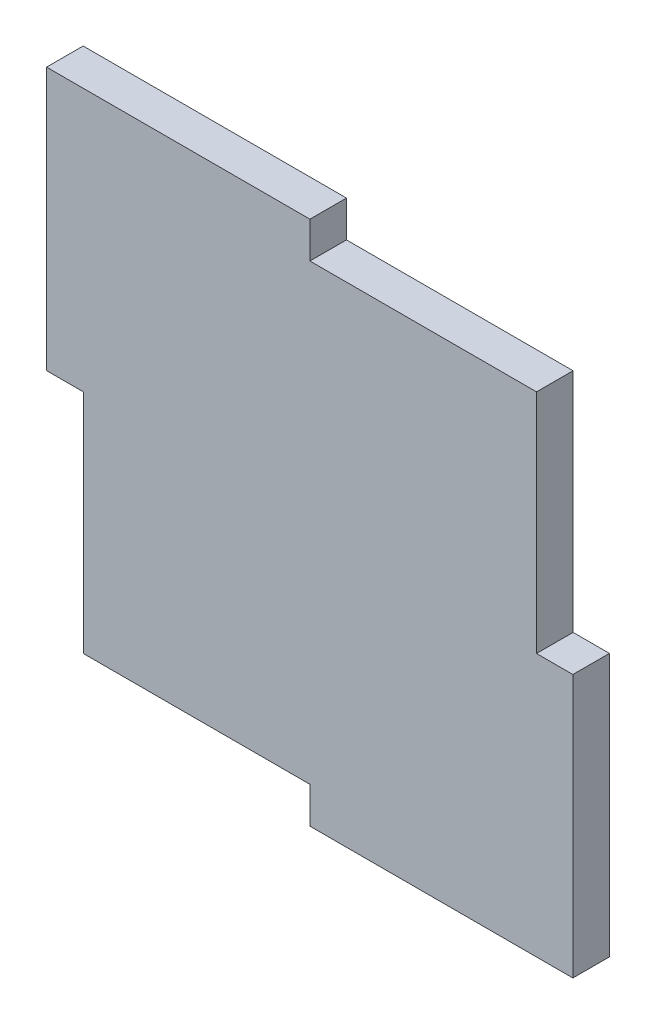
ISO-10303-21;
HEADER;
FILE_DESCRIPTION(('STEP AP214'),'2;1');
FILE_NAME('part.step','',(''),(''),'','','');
FILE_SCHEMA(('AUTOMOTIVE_DESIGN { 1 0 10303 214 1 1 1 1 }'));
ENDSEC;
DATA;
#1=APPLICATION_CONTEXT('core data for automotive mechanical design processes');
#2=APPLICATION_PROTOCOL_DEFINITION('international standard','automotive_design',2000,#1);
#3=PRODUCT_CONTEXT('',#1,'mechanical');
#4=PRODUCT('Part','Part','',(#3));
#5=PRODUCT_RELATED_PRODUCT_CATEGORY('part','',(#4));
#6=PRODUCT_DEFINITION_FORMATION('','',#4);
#7=PRODUCT_DEFINITION_CONTEXT('part definition',#1,'design');
#8=PRODUCT_DEFINITION('design','',#6,#7);
#9=PRODUCT_DEFINITION_SHAPE('','',#8);
#10=(LENGTH_UNIT() NAMED_UNIT(*) SI_UNIT(.MILLI.,.METRE.));
#11=(NAMED_UNIT(*) PLANE_ANGLE_UNIT() SI_UNIT($,.RADIAN.));
#12=(NAMED_UNIT(*) SI_UNIT($,.STERADIAN.) SOLID_ANGLE_UNIT());
#13=UNCERTAINTY_MEASURE_WITH_UNIT(LENGTH_MEASURE(1.E-05),#10,'distance_accuracy_value','');
#14=(GEOMETRIC_REPRESENTATION_CONTEXT(3) GLOBAL_UNCERTAINTY_ASSIGNED_CONTEXT((#13)) GLOBAL_UNIT_ASSIGNED_CONTEXT((#10,
#11,#12)) REPRESENTATION_CONTEXT('',''));
#15=CARTESIAN_POINT('',(0.,0.,0.));
#16=DIRECTION('',(0.,0.,1.));
#17=DIRECTION('',(1.,0.,0.));
#18=AXIS2_PLACEMENT_3D('',#15,#16,#17);
#19=CARTESIAN_POINT('',(22.1396252581876,0.,3.0734));
#20=DIRECTION('',(1.,0.,0.));
#21=DIRECTION('',(0.,0.,-1.));
#22=AXIS2_PLACEMENT_3D('',#19,#20,#21);
#23=PLANE('',#22);
#24=DIRECTION('',(0.,-1.,0.));
#25=VECTOR('',#24,1.);
#26=CARTESIAN_POINT('',(22.1396252581876,0.,0.));
#27=LINE('',#26,#25);
#28=CARTESIAN_POINT('',(22.1396252581876,0.,0.));
#29=VERTEX_POINT('',#28);
#30=CARTESIAN_POINT('',(22.1396252581876,-3.048,0.));
#31=VERTEX_POINT('',#30);
#32=EDGE_CURVE('E153',#29,#31,#27,.T.);
#33=ORIENTED_EDGE('',*,*,#32,.T.);
#34=DIRECTION('',(0.,0.,-1.));
#35=VECTOR('',#34,1.);
#36=CARTESIAN_POINT('',(22.1396252581876,-3.048,3.0734));
#37=LINE('',#36,#35);
#38=CARTESIAN_POINT('',(22.1396252581876,-3.048,3.0734));
#39=VERTEX_POINT('',#38);
#40=EDGE_CURVE('E11',#39,#31,#37,.T.);
#41=ORIENTED_EDGE('',*,*,#40,.F.);
#42=DIRECTION('',(0.,-1.,0.));
#43=VECTOR('',#42,1.);
#44=CARTESIAN_POINT('',(22.1396252581876,0.,3.0734));
#45=LINE('',#44,#43);
#46=CARTESIAN_POINT('',(22.1396252581876,0.,3.0734));
#47=VERTEX_POINT('',#46);
#48=EDGE_CURVE('E175',#47,#39,#45,.T.);
#49=ORIENTED_EDGE('',*,*,#48,.F.);
#50=DIRECTION('',(0.,0.,-1.));
#51=VECTOR('',#50,1.);
#52=CARTESIAN_POINT('',(22.1396252581876,0.,3.0734));
#53=LINE('',#52,#51);
#54=EDGE_CURVE('E149',#47,#29,#53,.T.);
#55=ORIENTED_EDGE('',*,*,#54,.T.);
#56=EDGE_LOOP('',(#33,#41,#49,#55));
#57=FACE_BOUND('',#56,.T.);
#58=ADVANCED_FACE('F33',(#57),#23,.F.);
#59=CARTESIAN_POINT('',(22.1396252581876,-3.048,3.0734));
#60=DIRECTION('',(0.,1.,0.));
#61=DIRECTION('',(0.,0.,1.));
#62=AXIS2_PLACEMENT_3D('',#59,#60,#61);
#63=PLANE('',#62);
#64=DIRECTION('',(1.,0.,0.));
#65=VECTOR('',#64,1.);
#66=CARTESIAN_POINT('',(22.1396252581876,-3.048,0.));
#67=LINE('',#66,#65);
#68=CARTESIAN_POINT('',(44.2453417417546,-3.048,0.));
#69=VERTEX_POINT('',#68);
#70=EDGE_CURVE('E156',#31,#69,#67,.T.);
#71=ORIENTED_EDGE('',*,*,#70,.T.);
#72=DIRECTION('',(0.,0.,-1.));
#73=VECTOR('',#72,1.);
#74=CARTESIAN_POINT('',(44.2453417417546,-3.048,3.0734));
#75=LINE('',#74,#73);
#76=CARTESIAN_POINT('',(44.2453417417546,-3.048,3.0734));
#77=VERTEX_POINT('',#76);
#78=EDGE_CURVE('E41',#77,#69,#75,.T.);
#79=ORIENTED_EDGE('',*,*,#78,.F.);
#80=DIRECTION('',(1.,0.,0.));
#81=VECTOR('',#80,1.);
#82=CARTESIAN_POINT('',(22.1396252581876,-3.048,3.0734));
#83=LINE('',#82,#81);
#84=EDGE_CURVE('E104',#39,#77,#83,.T.);
#85=ORIENTED_EDGE('',*,*,#84,.F.);
#86=ORIENTED_EDGE('',*,*,#40,.T.);
#87=EDGE_LOOP('',(#71,#79,#85,#86));
#88=FACE_BOUND('',#87,.T.);
#89=ADVANCED_FACE('F253',(#88),#63,.F.);
#90=CARTESIAN_POINT('',(44.2453417417546,19.05,3.0734));
#91=DIRECTION('',(-1.,0.,0.));
#92=DIRECTION('',(0.,0.,1.));
#93=AXIS2_PLACEMENT_3D('',#90,#91,#92);
#94=PLANE('',#93);
#95=DIRECTION('',(0.,1.,0.));
#96=VECTOR('',#95,1.);
#97=CARTESIAN_POINT('',(44.2453417417546,19.05,0.));
#98=LINE('',#97,#96);
#99=CARTESIAN_POINT('',(44.2453417417546,19.05,0.));
#100=VERTEX_POINT('',#99);
#101=EDGE_CURVE('E158',#69,#100,#98,.T.);
#102=ORIENTED_EDGE('',*,*,#101,.T.);
#103=DIRECTION('',(0.,0.,-1.));
#104=VECTOR('',#103,1.);
#105=CARTESIAN_POINT('',(44.2453417417546,19.05,3.0734));
#106=LINE('',#105,#104);
#107=CARTESIAN_POINT('',(44.2453417417546,19.05,3.0734));
#108=VERTEX_POINT('',#107);
#109=EDGE_CURVE('E194',#108,#100,#106,.T.);
#110=ORIENTED_EDGE('',*,*,#109,.F.);
#111=DIRECTION('',(0.,1.,0.));
#112=VECTOR('',#111,1.);
#113=CARTESIAN_POINT('',(44.2453417417546,19.05,3.0734));
#114=LINE('',#113,#112);
#115=EDGE_CURVE('E202',#77,#108,#114,.T.);
#116=ORIENTED_EDGE('',*,*,#115,.F.);
#117=ORIENTED_EDGE('',*,*,#78,.T.);
#118=EDGE_LOOP('',(#102,#110,#116,#117));
#119=FACE_BOUND('',#118,.T.);
#120=ADVANCED_FACE('F200',(#119),#94,.F.);
#121=CARTESIAN_POINT('',(41.1896252581876,19.05,3.0734));
#122=DIRECTION('',(0.,-1.,0.));
#123=DIRECTION('',(0.,0.,-1.));
#124=AXIS2_PLACEMENT_3D('',#121,#122,#123);
#125=PLANE('',#124);
#126=DIRECTION('',(-1.,0.,0.));
#127=VECTOR('',#126,1.);
#128=CARTESIAN_POINT('',(41.1896252581876,19.05,0.));
#129=LINE('',#128,#127);
#130=CARTESIAN_POINT('',(41.1896252581876,19.05,0.));
#131=VERTEX_POINT('',#130);
#132=EDGE_CURVE('E160',#100,#131,#129,.T.);
#133=ORIENTED_EDGE('',*,*,#132,.T.);
#134=DIRECTION('',(0.,0.,-1.));
#135=VECTOR('',#134,1.);
#136=CARTESIAN_POINT('',(41.1896252581876,19.05,3.0734));
#137=LINE('',#136,#135);
#138=CARTESIAN_POINT('',(41.1896252581876,19.05,3.0734));
#139=VERTEX_POINT('',#138);
#140=EDGE_CURVE('E191',#139,#131,#137,.T.);
#141=ORIENTED_EDGE('',*,*,#140,.F.);
#142=DIRECTION('',(-1.,0.,0.));
#143=VECTOR('',#142,1.);
#144=CARTESIAN_POINT('',(41.1896252581876,19.05,3.0734));
#145=LINE('',#144,#143);
#146=EDGE_CURVE('E220',#108,#139,#145,.T.);
#147=ORIENTED_EDGE('',*,*,#146,.F.);
#148=ORIENTED_EDGE('',*,*,#109,.T.);
#149=EDGE_LOOP('',(#133,#141,#147,#148));
#150=FACE_BOUND('',#149,.T.);
#151=ADVANCED_FACE('F211',(#150),#125,.F.);
#152=CARTESIAN_POINT('',(41.1896252581876,19.05,3.0734));
#153=DIRECTION('',(-1.,0.,0.));
#154=DIRECTION('',(0.,0.,1.));
#155=AXIS2_PLACEMENT_3D('',#152,#153,#154);
#156=PLANE('',#155);
#157=DIRECTION('',(0.,1.,0.));
#158=VECTOR('',#157,1.);
#159=CARTESIAN_POINT('',(41.1896252581876,19.05,0.));
#160=LINE('',#159,#158);
#161=CARTESIAN_POINT('',(41.1896252581876,38.1,0.));
#162=VERTEX_POINT('',#161);
#163=EDGE_CURVE('E162',#131,#162,#160,.T.);
#164=ORIENTED_EDGE('',*,*,#163,.T.);
#165=DIRECTION('',(0.,0.,-1.));
#166=VECTOR('',#165,1.);
#167=CARTESIAN_POINT('',(41.1896252581876,38.1,3.0734));
#168=LINE('',#167,#166);
#169=CARTESIAN_POINT('',(41.1896252581876,38.1,3.0734));
#170=VERTEX_POINT('',#169);
#171=EDGE_CURVE('E188',#170,#162,#168,.T.);
#172=ORIENTED_EDGE('',*,*,#171,.F.);
#173=DIRECTION('',(0.,1.,0.));
#174=VECTOR('',#173,1.);
#175=CARTESIAN_POINT('',(41.1896252581876,19.05,3.0734));
#176=LINE('',#175,#174);
#177=EDGE_CURVE('E217',#139,#170,#176,.T.);
#178=ORIENTED_EDGE('',*,*,#177,.F.);
#179=ORIENTED_EDGE('',*,*,#140,.T.);
#180=EDGE_LOOP('',(#164,#172,#178,#179));
#181=FACE_BOUND('',#180,.T.);
#182=ADVANCED_FACE('F215',(#181),#156,.F.);
#183=CARTESIAN_POINT('',(22.1396252581876,38.1,3.0734));
#184=DIRECTION('',(0.,-1.,0.));
#185=DIRECTION('',(0.,0.,-1.));
#186=AXIS2_PLACEMENT_3D('',#183,#184,#185);
#187=PLANE('',#186);
#188=DIRECTION('',(-1.,0.,0.));
#189=VECTOR('',#188,1.);
#190=CARTESIAN_POINT('',(22.1396252581876,38.1,0.));
#191=LINE('',#190,#189);
#192=CARTESIAN_POINT('',(22.1396252581876,38.1,0.));
#193=VERTEX_POINT('',#192);
#194=EDGE_CURVE('E164',#162,#193,#191,.T.);
#195=ORIENTED_EDGE('',*,*,#194,.T.);
#196=DIRECTION('',(0.,0.,-1.));
#197=VECTOR('',#196,1.);
#198=CARTESIAN_POINT('',(22.1396252581876,38.1,3.0734));
#199=LINE('',#198,#197);
#200=CARTESIAN_POINT('',(22.1396252581876,38.1,3.0734));
#201=VERTEX_POINT('',#200);
#202=EDGE_CURVE('E185',#201,#193,#199,.T.);
#203=ORIENTED_EDGE('',*,*,#202,.F.);
#204=DIRECTION('',(-1.,0.,0.));
#205=VECTOR('',#204,1.);
#206=CARTESIAN_POINT('',(22.1396252581876,38.1,3.0734));
#207=LINE('',#206,#205);
#208=EDGE_CURVE('E219',#170,#201,#207,.T.);
#209=ORIENTED_EDGE('',*,*,#208,.F.);
#210=ORIENTED_EDGE('',*,*,#171,.T.);
#211=EDGE_LOOP('',(#195,#203,#209,#210));
#212=FACE_BOUND('',#211,.T.);
#213=ADVANCED_FACE('F266',(#212),#187,.F.);
#214=CARTESIAN_POINT('',(22.1396252581876,38.1,3.0734));
#215=DIRECTION('',(-1.,0.,0.));
#216=DIRECTION('',(0.,-1.,0.));
#217=AXIS2_PLACEMENT_3D('',#214,#215,#216);
#218=PLANE('',#217);
#219=DIRECTION('',(0.,1.,0.));
#220=VECTOR('',#219,1.);
#221=CARTESIAN_POINT('',(22.1396252581876,38.1,0.));
#222=LINE('',#221,#220);
#223=CARTESIAN_POINT('',(22.1396252581876,41.148,0.));
#224=VERTEX_POINT('',#223);
#225=EDGE_CURVE('E166',#193,#224,#222,.T.);
#226=ORIENTED_EDGE('',*,*,#225,.T.);
#227=DIRECTION('',(0.,0.,-1.));
#228=VECTOR('',#227,1.);
#229=CARTESIAN_POINT('',(22.1396252581876,41.148,3.0734));
#230=LINE('',#229,#228);
#231=CARTESIAN_POINT('',(22.1396252581876,41.148,3.0734));
#232=VERTEX_POINT('',#231);
#233=EDGE_CURVE('E182',#232,#224,#230,.T.);
#234=ORIENTED_EDGE('',*,*,#233,.F.);
#235=DIRECTION('',(0.,1.,0.));
#236=VECTOR('',#235,1.);
#237=CARTESIAN_POINT('',(22.1396252581876,38.1,3.0734));
#238=LINE('',#237,#236);
#239=EDGE_CURVE('E222',#201,#232,#238,.T.);
#240=ORIENTED_EDGE('',*,*,#239,.F.);
#241=ORIENTED_EDGE('',*,*,#202,.T.);
#242=EDGE_LOOP('',(#226,#234,#240,#241));
#243=FACE_BOUND('',#242,.T.);
#244=ADVANCED_FACE('F269',(#243),#218,.F.);
#245=CARTESIAN_POINT('',(22.1396252581876,41.148,3.0734));
#246=DIRECTION('',(0.,-1.,0.));
#247=DIRECTION('',(0.,0.,-1.));
#248=AXIS2_PLACEMENT_3D('',#245,#246,#247);
#249=PLANE('',#248);
#250=DIRECTION('',(-1.,0.,0.));
#251=VECTOR('',#250,1.);
#252=CARTESIAN_POINT('',(22.1396252581876,41.148,0.));
#253=LINE('',#252,#251);
#254=CARTESIAN_POINT('',(0.,41.148,0.));
#255=VERTEX_POINT('',#254);
#256=EDGE_CURVE('E168',#224,#255,#253,.T.);
#257=ORIENTED_EDGE('',*,*,#256,.T.);
#258=DIRECTION('',(0.,0.,-1.));
#259=VECTOR('',#258,1.);
#260=CARTESIAN_POINT('',(0.,41.148,3.0734));
#261=LINE('',#260,#259);
#262=CARTESIAN_POINT('',(0.,41.148,3.0734));
#263=VERTEX_POINT('',#262);
#264=EDGE_CURVE('E179',#263,#255,#261,.T.);
#265=ORIENTED_EDGE('',*,*,#264,.F.);
#266=DIRECTION('',(-1.,0.,0.));
#267=VECTOR('',#266,1.);
#268=CARTESIAN_POINT('',(22.1396252581876,41.148,3.0734));
#269=LINE('',#268,#267);
#270=EDGE_CURVE('E228',#232,#263,#269,.T.);
#271=ORIENTED_EDGE('',*,*,#270,.F.);
#272=ORIENTED_EDGE('',*,*,#233,.T.);
#273=EDGE_LOOP('',(#257,#265,#271,#272));
#274=FACE_BOUND('',#273,.T.);
#275=ADVANCED_FACE('F234',(#274),#249,.F.);
#276=CARTESIAN_POINT('',(0.,41.148,3.0734));
#277=DIRECTION('',(1.,0.,0.));
#278=DIRECTION('',(0.,0.,-1.));
#279=AXIS2_PLACEMENT_3D('',#276,#277,#278);
#280=PLANE('',#279);
#281=DIRECTION('',(0.,-1.,0.));
#282=VECTOR('',#281,1.);
#283=CARTESIAN_POINT('',(0.,41.148,0.));
#284=LINE('',#283,#282);
#285=CARTESIAN_POINT('',(0.,19.05,0.));
#286=VERTEX_POINT('',#285);
#287=EDGE_CURVE('E170',#255,#286,#284,.T.);
#288=ORIENTED_EDGE('',*,*,#287,.T.);
#289=DIRECTION('',(0.,0.,-1.));
#290=VECTOR('',#289,1.);
#291=CARTESIAN_POINT('',(0.,19.05,3.0734));
#292=LINE('',#291,#290);
#293=CARTESIAN_POINT('',(0.,19.05,3.0734));
#294=VERTEX_POINT('',#293);
#295=EDGE_CURVE('E144',#294,#286,#292,.T.);
#296=ORIENTED_EDGE('',*,*,#295,.F.);
#297=DIRECTION('',(0.,-1.,0.));
#298=VECTOR('',#297,1.);
#299=CARTESIAN_POINT('',(0.,41.148,3.0734));
#300=LINE('',#299,#298);
#301=EDGE_CURVE('E135',#263,#294,#300,.T.);
#302=ORIENTED_EDGE('',*,*,#301,.F.);
#303=ORIENTED_EDGE('',*,*,#264,.T.);
#304=EDGE_LOOP('',(#288,#296,#302,#303));
#305=FACE_BOUND('',#304,.T.);
#306=ADVANCED_FACE('F238',(#305),#280,.F.);
#307=CARTESIAN_POINT('',(0.,19.05,3.0734));
#308=DIRECTION('',(0.,1.,0.));
#309=DIRECTION('',(0.,0.,1.));
#310=AXIS2_PLACEMENT_3D('',#307,#308,#309);
#311=PLANE('',#310);
#312=DIRECTION('',(1.,0.,0.));
#313=VECTOR('',#312,1.);
#314=CARTESIAN_POINT('',(0.,19.05,0.));
#315=LINE('',#314,#313);
#316=CARTESIAN_POINT('',(3.08962525818759,19.05,0.));
#317=VERTEX_POINT('',#316);
#318=EDGE_CURVE('E143',#286,#317,#315,.T.);
#319=ORIENTED_EDGE('',*,*,#318,.T.);
#320=DIRECTION('',(0.,0.,-1.));
#321=VECTOR('',#320,1.);
#322=CARTESIAN_POINT('',(3.08962525818759,19.05,3.0734));
#323=LINE('',#322,#321);
#324=CARTESIAN_POINT('',(3.08962525818759,19.05,3.0734));
#325=VERTEX_POINT('',#324);
#326=EDGE_CURVE('E140',#325,#317,#323,.T.);
#327=ORIENTED_EDGE('',*,*,#326,.F.);
#328=DIRECTION('',(1.,0.,0.));
#329=VECTOR('',#328,1.);
#330=CARTESIAN_POINT('',(0.,19.05,3.0734));
#331=LINE('',#330,#329);
#332=EDGE_CURVE('E129',#294,#325,#331,.T.);
#333=ORIENTED_EDGE('',*,*,#332,.F.);
#334=ORIENTED_EDGE('',*,*,#295,.T.);
#335=EDGE_LOOP('',(#319,#327,#333,#334));
#336=FACE_BOUND('',#335,.T.);
#337=ADVANCED_FACE('F141',(#336),#311,.F.);
#338=CARTESIAN_POINT('',(3.08962525818759,19.05,3.0734));
#339=DIRECTION('',(1.,0.,0.));
#340=DIRECTION('',(0.,1.,0.));
#341=AXIS2_PLACEMENT_3D('',#338,#339,#340);
#342=PLANE('',#341);
#343=DIRECTION('',(0.,-1.,0.));
#344=VECTOR('',#343,1.);
#345=CARTESIAN_POINT('',(3.08962525818759,19.05,0.));
#346=LINE('',#345,#344);
#347=CARTESIAN_POINT('',(3.08962525818759,0.,0.));
#348=VERTEX_POINT('',#347);
#349=EDGE_CURVE('E90',#317,#348,#346,.T.);
#350=ORIENTED_EDGE('',*,*,#349,.T.);
#351=DIRECTION('',(0.,0.,-1.));
#352=VECTOR('',#351,1.);
#353=CARTESIAN_POINT('',(3.08962525818759,0.,3.0734));
#354=LINE('',#353,#352);
#355=CARTESIAN_POINT('',(3.08962525818759,0.,3.0734));
#356=VERTEX_POINT('',#355);
#357=EDGE_CURVE('E145',#356,#348,#354,.T.);
#358=ORIENTED_EDGE('',*,*,#357,.F.);
#359=DIRECTION('',(0.,-1.,0.));
#360=VECTOR('',#359,1.);
#361=CARTESIAN_POINT('',(3.08962525818759,19.05,3.0734));
#362=LINE('',#361,#360);
#363=EDGE_CURVE('E133',#325,#356,#362,.T.);
#364=ORIENTED_EDGE('',*,*,#363,.F.);
#365=ORIENTED_EDGE('',*,*,#326,.T.);
#366=EDGE_LOOP('',(#350,#358,#364,#365));
#367=FACE_BOUND('',#366,.T.);
#368=ADVANCED_FACE('F147',(#367),#342,.F.);
#369=CARTESIAN_POINT('',(3.08962525818759,0.,3.0734));
#370=DIRECTION('',(0.,1.,0.));
#371=DIRECTION('',(0.,0.,1.));
#372=AXIS2_PLACEMENT_3D('',#369,#370,#371);
#373=PLANE('',#372);
#374=DIRECTION('',(1.,0.,0.));
#375=VECTOR('',#374,1.);
#376=CARTESIAN_POINT('',(3.08962525818759,0.,0.));
#377=LINE('',#376,#375);
#378=EDGE_CURVE('E96',#348,#29,#377,.T.);
#379=ORIENTED_EDGE('',*,*,#378,.T.);
#380=ORIENTED_EDGE('',*,*,#54,.F.);
#381=DIRECTION('',(1.,0.,0.));
#382=VECTOR('',#381,1.);
#383=CARTESIAN_POINT('',(3.08962525818759,0.,3.0734));
#384=LINE('',#383,#382);
#385=EDGE_CURVE('E49',#356,#47,#384,.T.);
#386=ORIENTED_EDGE('',*,*,#385,.F.);
#387=ORIENTED_EDGE('',*,*,#357,.T.);
#388=EDGE_LOOP('',(#379,#380,#386,#387));
#389=FACE_BOUND('',#388,.T.);
#390=ADVANCED_FACE('F242',(#389),#373,.F.);
#391=CARTESIAN_POINT('',(0.,0.,3.0734));
#392=DIRECTION('',(0.,0.,1.));
#393=DIRECTION('',(1.,0.,0.));
#394=AXIS2_PLACEMENT_3D('',#391,#392,#393);
#395=PLANE('',#394);
#396=ORIENTED_EDGE('',*,*,#48,.T.);
#397=ORIENTED_EDGE('',*,*,#84,.T.);
#398=ORIENTED_EDGE('',*,*,#115,.T.);
#399=ORIENTED_EDGE('',*,*,#146,.T.);
#400=ORIENTED_EDGE('',*,*,#177,.T.);
#401=ORIENTED_EDGE('',*,*,#208,.T.);
#402=ORIENTED_EDGE('',*,*,#239,.T.);
#403=ORIENTED_EDGE('',*,*,#270,.T.);
#404=ORIENTED_EDGE('',*,*,#301,.T.);
#405=ORIENTED_EDGE('',*,*,#332,.T.);
#406=ORIENTED_EDGE('',*,*,#363,.T.);
#407=ORIENTED_EDGE('',*,*,#385,.T.);
#408=EDGE_LOOP('',(#396,#397,#398,#399,#400,#401,#402,#403,#404,#405,#406,#407));
#409=FACE_BOUND('',#408,.T.);
#410=ADVANCED_FACE('F131',(#409),#395,.T.);
#411=CARTESIAN_POINT('',(0.,0.,0.));
#412=DIRECTION('',(0.,0.,1.));
#413=DIRECTION('',(1.,0.,0.));
#414=AXIS2_PLACEMENT_3D('',#411,#412,#413);
#415=PLANE('',#414);
#416=ORIENTED_EDGE('',*,*,#32,.F.);
#417=ORIENTED_EDGE('',*,*,#378,.F.);
#418=ORIENTED_EDGE('',*,*,#349,.F.);
#419=ORIENTED_EDGE('',*,*,#318,.F.);
#420=ORIENTED_EDGE('',*,*,#287,.F.);
#421=ORIENTED_EDGE('',*,*,#256,.F.);
#422=ORIENTED_EDGE('',*,*,#225,.F.);
#423=ORIENTED_EDGE('',*,*,#194,.F.);
#424=ORIENTED_EDGE('',*,*,#163,.F.);
#425=ORIENTED_EDGE('',*,*,#132,.F.);
#426=ORIENTED_EDGE('',*,*,#101,.F.);
#427=ORIENTED_EDGE('',*,*,#70,.F.);
#428=EDGE_LOOP('',(#416,#417,#418,#419,#420,#421,#422,#423,#424,#425,#426,#427));
#429=FACE_BOUND('',#428,.T.);
#430=ADVANCED_FACE('F206',(#429),#415,.F.);
#431=CLOSED_SHELL('',(#58,#89,#120,#151,#182,#213,#244,#275,#306,#337,#368,#390,#410,#430));
#432=MANIFOLD_SOLID_BREP('B2',#431);
#433=ADVANCED_BREP_SHAPE_REPRESENTATION('',(#18,#432),#14);
#434=SHAPE_DEFINITION_REPRESENTATION(#9,#433);
ENDSEC;
END-ISO-10303-21;
